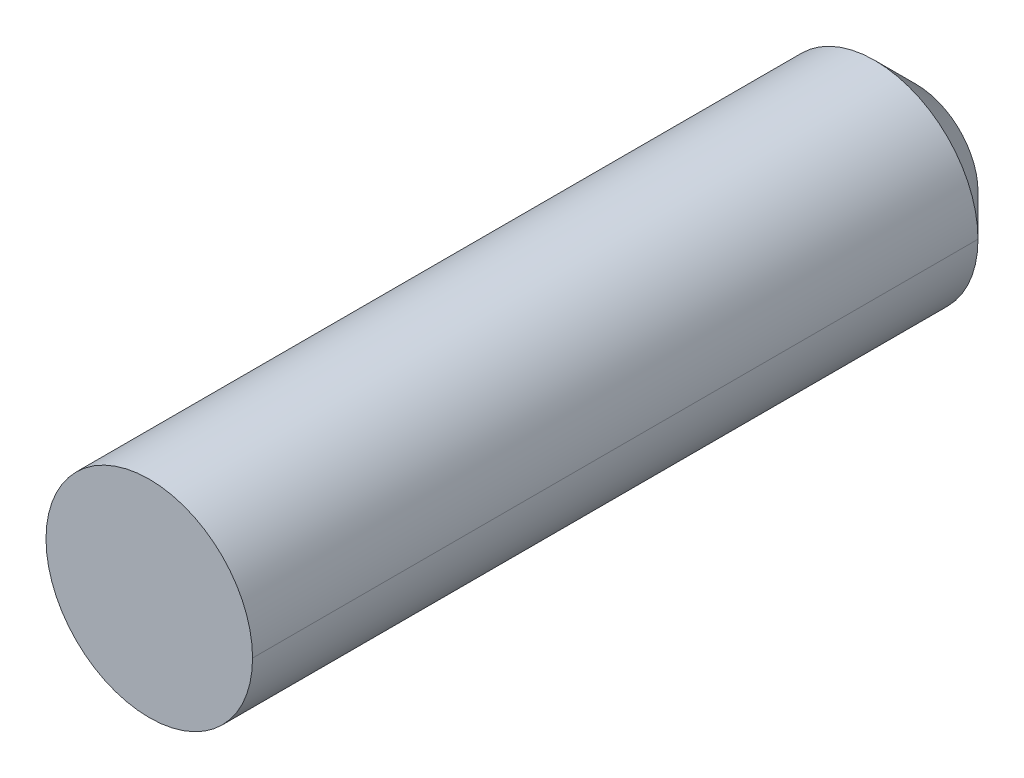
ISO-10303-21;
HEADER;
FILE_DESCRIPTION(('STEP AP214'),'2;1');
FILE_NAME('part.step','',(''),(''),'','','');
FILE_SCHEMA(('AUTOMOTIVE_DESIGN { 1 0 10303 214 1 1 1 1 }'));
ENDSEC;
DATA;
#1=APPLICATION_CONTEXT('core data for automotive mechanical design processes');
#2=APPLICATION_PROTOCOL_DEFINITION('international standard','automotive_design',2000,#1);
#3=PRODUCT_CONTEXT('',#1,'mechanical');
#4=PRODUCT('Part','Part','',(#3));
#5=PRODUCT_RELATED_PRODUCT_CATEGORY('part','',(#4));
#6=PRODUCT_DEFINITION_FORMATION('','',#4);
#7=PRODUCT_DEFINITION_CONTEXT('part definition',#1,'design');
#8=PRODUCT_DEFINITION('design','',#6,#7);
#9=PRODUCT_DEFINITION_SHAPE('','',#8);
#10=(LENGTH_UNIT() NAMED_UNIT(*) SI_UNIT(.MILLI.,.METRE.));
#11=(NAMED_UNIT(*) PLANE_ANGLE_UNIT() SI_UNIT($,.RADIAN.));
#12=(NAMED_UNIT(*) SI_UNIT($,.STERADIAN.) SOLID_ANGLE_UNIT());
#13=UNCERTAINTY_MEASURE_WITH_UNIT(LENGTH_MEASURE(1.E-05),#10,'distance_accuracy_value','');
#14=(GEOMETRIC_REPRESENTATION_CONTEXT(3) GLOBAL_UNCERTAINTY_ASSIGNED_CONTEXT((#13)) GLOBAL_UNIT_ASSIGNED_CONTEXT((#10,
#11,#12)) REPRESENTATION_CONTEXT('',''));
#15=CARTESIAN_POINT('',(0.,0.,0.));
#16=DIRECTION('',(0.,0.,1.));
#17=DIRECTION('',(1.,0.,0.));
#18=AXIS2_PLACEMENT_3D('',#15,#16,#17);
#19=CARTESIAN_POINT('',(0.,0.,-5.733051224214));
#20=DIRECTION('',(0.,0.,-1.));
#21=DIRECTION('',(-1.,0.,0.));
#22=AXIS2_PLACEMENT_3D('',#19,#20,#21);
#23=CYLINDRICAL_SURFACE('',#22,0.635);
#24=CARTESIAN_POINT('',(0.,0.,0.77724));
#25=DIRECTION('',(0.,0.,-1.));
#26=DIRECTION('',(-1.,0.,0.));
#27=AXIS2_PLACEMENT_3D('',#24,#25,#26);
#28=CIRCLE('',#27,0.635);
#29=CARTESIAN_POINT('',(-0.635,0.,0.77724));
#30=VERTEX_POINT('',#29);
#31=CARTESIAN_POINT('',(0.635,0.,0.77724));
#32=VERTEX_POINT('',#31);
#33=EDGE_CURVE('E11',#30,#32,#28,.T.);
#34=ORIENTED_EDGE('',*,*,#33,.T.);
#35=DIRECTION('',(0.,0.,-1.));
#36=VECTOR('',#35,1.);
#37=CARTESIAN_POINT('',(0.635,0.,-5.733051224214));
#38=LINE('',#37,#36);
#39=CARTESIAN_POINT('',(0.635000000069,0.,-3.683));
#40=VERTEX_POINT('',#39);
#41=EDGE_CURVE('E28',#32,#40,#38,.T.);
#42=ORIENTED_EDGE('',*,*,#41,.T.);
#43=CARTESIAN_POINT('',(0.,0.,-3.683));
#44=DIRECTION('',(0.,0.,1.));
#45=DIRECTION('',(-1.,0.,0.));
#46=AXIS2_PLACEMENT_3D('',#43,#44,#45);
#47=CIRCLE('',#46,0.635);
#48=CARTESIAN_POINT('',(-0.635000000069,0.,-3.683));
#49=VERTEX_POINT('',#48);
#50=EDGE_CURVE('E84',#40,#49,#47,.T.);
#51=ORIENTED_EDGE('',*,*,#50,.T.);
#52=DIRECTION('',(0.,0.,-1.));
#53=VECTOR('',#52,1.);
#54=CARTESIAN_POINT('',(-0.635,0.,-5.733051224214));
#55=LINE('',#54,#53);
#56=EDGE_CURVE('E55',#30,#49,#55,.T.);
#57=ORIENTED_EDGE('',*,*,#56,.F.);
#58=EDGE_LOOP('',(#34,#42,#51,#57));
#59=FACE_BOUND('',#58,.T.);
#60=ADVANCED_FACE('F17',(#59),#23,.T.);
#61=CARTESIAN_POINT('',(0.,0.,-3.683000000137));
#62=DIRECTION('',(0.,0.,1.));
#63=DIRECTION('',(1.,0.,0.));
#64=AXIS2_PLACEMENT_3D('',#61,#62,#63);
#65=CONICAL_SURFACE('',#64,0.634999999932,0.785398163397);
#66=CARTESIAN_POINT('',(0.,0.,-3.937000000008));
#67=DIRECTION('',(0.,0.,1.));
#68=DIRECTION('',(1.,0.,0.));
#69=AXIS2_PLACEMENT_3D('',#66,#67,#68);
#70=CIRCLE('',#69,0.381000000061);
#71=CARTESIAN_POINT('',(0.381000000061,0.,-3.937000000008));
#72=VERTEX_POINT('',#71);
#73=CARTESIAN_POINT('',(-0.381000000061,0.,-3.937000000008));
#74=VERTEX_POINT('',#73);
#75=EDGE_CURVE('E21',#72,#74,#70,.T.);
#76=ORIENTED_EDGE('',*,*,#75,.T.);
#77=DIRECTION('',(-0.707106781186548,0.,0.707106781186548));
#78=VECTOR('',#77,1.);
#79=CARTESIAN_POINT('',(-0.634999999932,0.,-3.683000000137));
#80=LINE('',#79,#78);
#81=EDGE_CURVE('E69',#74,#49,#80,.T.);
#82=ORIENTED_EDGE('',*,*,#81,.T.);
#83=ORIENTED_EDGE('',*,*,#50,.F.);
#84=DIRECTION('',(0.707106781186548,0.,0.707106781186548));
#85=VECTOR('',#84,1.);
#86=CARTESIAN_POINT('',(0.634999999932,0.,-3.683000000137));
#87=LINE('',#86,#85);
#88=EDGE_CURVE('E81',#72,#40,#87,.T.);
#89=ORIENTED_EDGE('',*,*,#88,.F.);
#90=EDGE_LOOP('',(#76,#82,#83,#89));
#91=FACE_BOUND('',#90,.T.);
#92=ADVANCED_FACE('F19',(#91),#65,.T.);
#93=CARTESIAN_POINT('',(0.,0.,-5.733051224214));
#94=DIRECTION('',(0.,0.,-1.));
#95=DIRECTION('',(-1.,0.,0.));
#96=AXIS2_PLACEMENT_3D('',#93,#94,#95);
#97=CYLINDRICAL_SURFACE('',#96,0.635);
#98=ORIENTED_EDGE('',*,*,#41,.F.);
#99=CARTESIAN_POINT('',(0.,0.,0.77724));
#100=DIRECTION('',(0.,0.,-1.));
#101=DIRECTION('',(-1.,0.,0.));
#102=AXIS2_PLACEMENT_3D('',#99,#100,#101);
#103=CIRCLE('',#102,0.635);
#104=EDGE_CURVE('E78',#32,#30,#103,.T.);
#105=ORIENTED_EDGE('',*,*,#104,.T.);
#106=ORIENTED_EDGE('',*,*,#56,.T.);
#107=CARTESIAN_POINT('',(0.,0.,-3.683));
#108=DIRECTION('',(0.,0.,1.));
#109=DIRECTION('',(-1.,0.,0.));
#110=AXIS2_PLACEMENT_3D('',#107,#108,#109);
#111=CIRCLE('',#110,0.635);
#112=EDGE_CURVE('E74',#49,#40,#111,.T.);
#113=ORIENTED_EDGE('',*,*,#112,.T.);
#114=EDGE_LOOP('',(#98,#105,#106,#113));
#115=FACE_BOUND('',#114,.T.);
#116=ADVANCED_FACE('F106',(#115),#97,.T.);
#117=CARTESIAN_POINT('',(0.,0.,-3.683000000137));
#118=DIRECTION('',(0.,0.,1.));
#119=DIRECTION('',(1.,0.,0.));
#120=AXIS2_PLACEMENT_3D('',#117,#118,#119);
#121=CONICAL_SURFACE('',#120,0.634999999932,0.785398163397);
#122=ORIENTED_EDGE('',*,*,#81,.F.);
#123=CARTESIAN_POINT('',(0.,0.,-3.937000000008));
#124=DIRECTION('',(0.,0.,1.));
#125=DIRECTION('',(1.,0.,0.));
#126=AXIS2_PLACEMENT_3D('',#123,#124,#125);
#127=CIRCLE('',#126,0.381000000061);
#128=EDGE_CURVE('E73',#74,#72,#127,.T.);
#129=ORIENTED_EDGE('',*,*,#128,.T.);
#130=ORIENTED_EDGE('',*,*,#88,.T.);
#131=ORIENTED_EDGE('',*,*,#112,.F.);
#132=EDGE_LOOP('',(#122,#129,#130,#131));
#133=FACE_BOUND('',#132,.T.);
#134=ADVANCED_FACE('F71',(#133),#121,.T.);
#135=CARTESIAN_POINT('',(0.,0.,0.77724));
#136=DIRECTION('',(0.,0.,-1.));
#137=DIRECTION('',(0.,-1.,0.));
#138=AXIS2_PLACEMENT_3D('',#135,#136,#137);
#139=PLANE('',#138);
#140=ORIENTED_EDGE('',*,*,#33,.F.);
#141=ORIENTED_EDGE('',*,*,#104,.F.);
#142=EDGE_LOOP('',(#140,#141));
#143=FACE_BOUND('',#142,.T.);
#144=ADVANCED_FACE('F119',(#143),#139,.F.);
#145=CARTESIAN_POINT('',(2.032,3.048,-3.937));
#146=DIRECTION('',(0.,0.,-1.));
#147=DIRECTION('',(0.,-1.,0.));
#148=AXIS2_PLACEMENT_3D('',#145,#146,#147);
#149=PLANE('',#148);
#150=ORIENTED_EDGE('',*,*,#75,.F.);
#151=ORIENTED_EDGE('',*,*,#128,.F.);
#152=EDGE_LOOP('',(#150,#151));
#153=FACE_BOUND('',#152,.T.);
#154=ADVANCED_FACE('F85',(#153),#149,.T.);
#155=CLOSED_SHELL('',(#60,#92,#116,#134,#144,#154));
#156=MANIFOLD_SOLID_BREP('B1',#155);
#157=ADVANCED_BREP_SHAPE_REPRESENTATION('',(#18,#156),#14);
#158=SHAPE_DEFINITION_REPRESENTATION(#9,#157);
ENDSEC;
END-ISO-10303-21;
